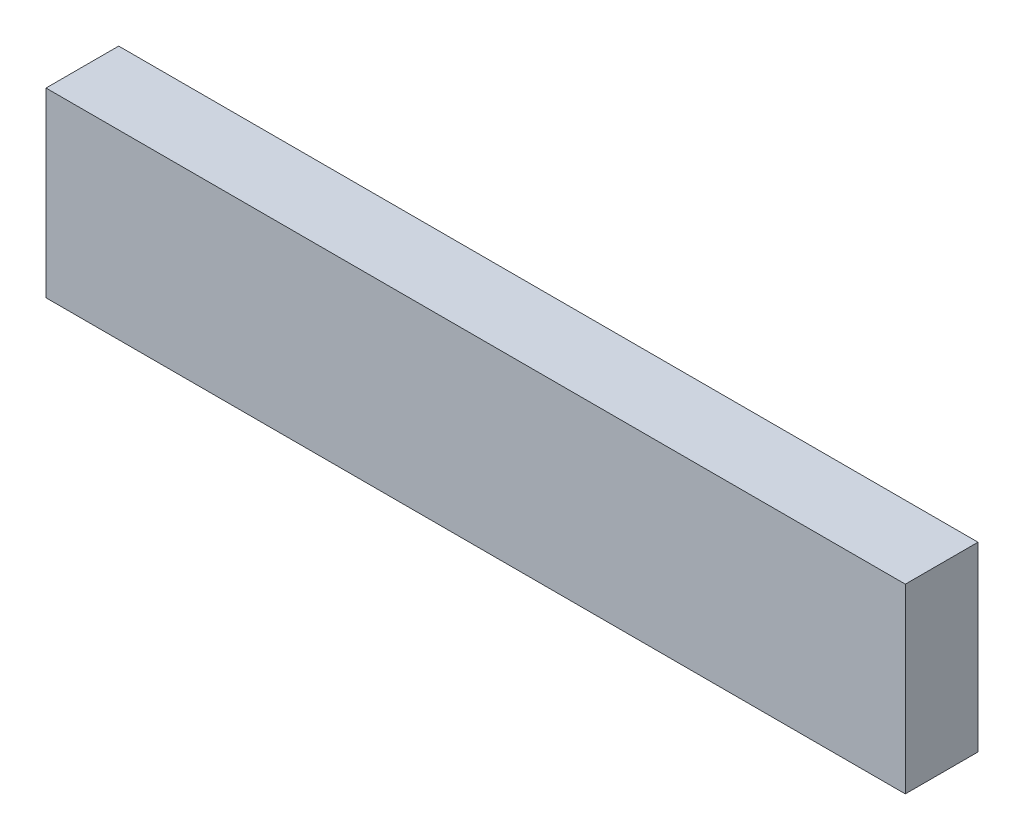
ISO-10303-21;
HEADER;
FILE_DESCRIPTION(('STEP AP214'),'2;1');
FILE_NAME('part.step','',(''),(''),'','','');
FILE_SCHEMA(('AUTOMOTIVE_DESIGN { 1 0 10303 214 1 1 1 1 }'));
ENDSEC;
DATA;
#1=APPLICATION_CONTEXT('core data for automotive mechanical design processes');
#2=APPLICATION_PROTOCOL_DEFINITION('international standard','automotive_design',2000,#1);
#3=PRODUCT_CONTEXT('',#1,'mechanical');
#4=PRODUCT('Part','Part','',(#3));
#5=PRODUCT_RELATED_PRODUCT_CATEGORY('part','',(#4));
#6=PRODUCT_DEFINITION_FORMATION('','',#4);
#7=PRODUCT_DEFINITION_CONTEXT('part definition',#1,'design');
#8=PRODUCT_DEFINITION('design','',#6,#7);
#9=PRODUCT_DEFINITION_SHAPE('','',#8);
#10=(LENGTH_UNIT() NAMED_UNIT(*) SI_UNIT(.MILLI.,.METRE.));
#11=(NAMED_UNIT(*) PLANE_ANGLE_UNIT() SI_UNIT($,.RADIAN.));
#12=(NAMED_UNIT(*) SI_UNIT($,.STERADIAN.) SOLID_ANGLE_UNIT());
#13=UNCERTAINTY_MEASURE_WITH_UNIT(LENGTH_MEASURE(1.E-05),#10,'distance_accuracy_value','');
#14=(GEOMETRIC_REPRESENTATION_CONTEXT(3) GLOBAL_UNCERTAINTY_ASSIGNED_CONTEXT((#13)) GLOBAL_UNIT_ASSIGNED_CONTEXT((#10,
#11,#12)) REPRESENTATION_CONTEXT('',''));
#15=CARTESIAN_POINT('',(0.,0.,0.));
#16=DIRECTION('',(0.,0.,1.));
#17=DIRECTION('',(1.,0.,0.));
#18=AXIS2_PLACEMENT_3D('',#15,#16,#17);
#19=CARTESIAN_POINT('',(0.,0.,304.301184893806));
#20=DIRECTION('',(0.,0.,1.));
#21=DIRECTION('',(1.,0.,0.));
#22=AXIS2_PLACEMENT_3D('',#19,#20,#21);
#23=PLANE('',#22);
#24=DIRECTION('',(0.,-1.,0.));
#25=VECTOR('',#24,1.);
#26=CARTESIAN_POINT('',(191.3,77.9866537043276,304.301184893806));
#27=LINE('',#26,#25);
#28=CARTESIAN_POINT('',(191.3,77.9866537043276,304.301184893806));
#29=VERTEX_POINT('',#28);
#30=CARTESIAN_POINT('',(191.3,67.9866537043276,304.301184893806));
#31=VERTEX_POINT('',#30);
#32=EDGE_CURVE('E80',#29,#31,#27,.T.);
#33=ORIENTED_EDGE('',*,*,#32,.T.);
#34=DIRECTION('',(1.,0.,0.));
#35=VECTOR('',#34,1.);
#36=CARTESIAN_POINT('',(191.3,67.9866537043276,304.301184893806));
#37=LINE('',#36,#35);
#38=CARTESIAN_POINT('',(238.599999999999,67.9866537043276,304.301184893806));
#39=VERTEX_POINT('',#38);
#40=EDGE_CURVE('E76',#31,#39,#37,.T.);
#41=ORIENTED_EDGE('',*,*,#40,.T.);
#42=DIRECTION('',(0.,1.,0.));
#43=VECTOR('',#42,1.);
#44=CARTESIAN_POINT('',(238.599999999999,77.9866537043276,304.301184893806));
#45=LINE('',#44,#43);
#46=CARTESIAN_POINT('',(238.599999999999,77.9866537043276,304.301184893806));
#47=VERTEX_POINT('',#46);
#48=EDGE_CURVE('E78',#39,#47,#45,.T.);
#49=ORIENTED_EDGE('',*,*,#48,.T.);
#50=DIRECTION('',(-1.,0.,0.));
#51=VECTOR('',#50,1.);
#52=CARTESIAN_POINT('',(191.3,77.9866537043276,304.301184893806));
#53=LINE('',#52,#51);
#54=EDGE_CURVE('E50',#47,#29,#53,.T.);
#55=ORIENTED_EDGE('',*,*,#54,.T.);
#56=EDGE_LOOP('',(#33,#41,#49,#55));
#57=FACE_BOUND('',#56,.T.);
#58=ADVANCED_FACE('F33',(#57),#23,.T.);
#59=CARTESIAN_POINT('',(191.3,77.9866537043276,304.301184893806));
#60=DIRECTION('',(0.,-1.,0.));
#61=DIRECTION('',(0.,0.,-1.));
#62=AXIS2_PLACEMENT_3D('',#59,#60,#61);
#63=PLANE('',#62);
#64=DIRECTION('',(-1.,0.,0.));
#65=VECTOR('',#64,1.);
#66=CARTESIAN_POINT('',(191.3,77.9866537043276,300.301184893806));
#67=LINE('',#66,#65);
#68=CARTESIAN_POINT('',(238.599999999999,77.9866537043276,300.301184893806));
#69=VERTEX_POINT('',#68);
#70=CARTESIAN_POINT('',(191.3,77.9866537043276,300.301184893806));
#71=VERTEX_POINT('',#70);
#72=EDGE_CURVE('E95',#69,#71,#67,.T.);
#73=ORIENTED_EDGE('',*,*,#72,.T.);
#74=DIRECTION('',(0.,0.,-1.));
#75=VECTOR('',#74,1.);
#76=CARTESIAN_POINT('',(191.3,77.9866537043276,304.301184893806));
#77=LINE('',#76,#75);
#78=EDGE_CURVE('E90',#29,#71,#77,.T.);
#79=ORIENTED_EDGE('',*,*,#78,.F.);
#80=ORIENTED_EDGE('',*,*,#54,.F.);
#81=DIRECTION('',(0.,0.,-1.));
#82=VECTOR('',#81,1.);
#83=CARTESIAN_POINT('',(238.599999999999,77.9866537043276,304.301184893806));
#84=LINE('',#83,#82);
#85=EDGE_CURVE('E85',#47,#69,#84,.T.);
#86=ORIENTED_EDGE('',*,*,#85,.T.);
#87=EDGE_LOOP('',(#73,#79,#80,#86));
#88=FACE_BOUND('',#87,.T.);
#89=ADVANCED_FACE('F107',(#88),#63,.F.);
#90=CARTESIAN_POINT('',(238.599999999999,77.9866537043276,304.301184893806));
#91=DIRECTION('',(-1.,0.,0.));
#92=DIRECTION('',(0.,0.,1.));
#93=AXIS2_PLACEMENT_3D('',#90,#91,#92);
#94=PLANE('',#93);
#95=DIRECTION('',(0.,1.,0.));
#96=VECTOR('',#95,1.);
#97=CARTESIAN_POINT('',(238.599999999999,77.9866537043276,300.301184893806));
#98=LINE('',#97,#96);
#99=CARTESIAN_POINT('',(238.599999999999,67.9866537043276,300.301184893806));
#100=VERTEX_POINT('',#99);
#101=EDGE_CURVE('E70',#100,#69,#98,.T.);
#102=ORIENTED_EDGE('',*,*,#101,.T.);
#103=ORIENTED_EDGE('',*,*,#85,.F.);
#104=ORIENTED_EDGE('',*,*,#48,.F.);
#105=DIRECTION('',(0.,0.,-1.));
#106=VECTOR('',#105,1.);
#107=CARTESIAN_POINT('',(238.599999999999,67.9866537043276,304.301184893806));
#108=LINE('',#107,#106);
#109=EDGE_CURVE('E83',#39,#100,#108,.T.);
#110=ORIENTED_EDGE('',*,*,#109,.T.);
#111=EDGE_LOOP('',(#102,#103,#104,#110));
#112=FACE_BOUND('',#111,.T.);
#113=ADVANCED_FACE('F87',(#112),#94,.F.);
#114=CARTESIAN_POINT('',(191.3,67.9866537043276,304.301184893806));
#115=DIRECTION('',(0.,1.,0.));
#116=DIRECTION('',(0.,0.,1.));
#117=AXIS2_PLACEMENT_3D('',#114,#115,#116);
#118=PLANE('',#117);
#119=DIRECTION('',(1.,0.,0.));
#120=VECTOR('',#119,1.);
#121=CARTESIAN_POINT('',(191.3,67.9866537043276,300.301184893806));
#122=LINE('',#121,#120);
#123=CARTESIAN_POINT('',(191.3,67.9866537043276,300.301184893806));
#124=VERTEX_POINT('',#123);
#125=EDGE_CURVE('E11',#124,#100,#122,.T.);
#126=ORIENTED_EDGE('',*,*,#125,.T.);
#127=ORIENTED_EDGE('',*,*,#109,.F.);
#128=ORIENTED_EDGE('',*,*,#40,.F.);
#129=DIRECTION('',(0.,0.,-1.));
#130=VECTOR('',#129,1.);
#131=CARTESIAN_POINT('',(191.3,67.9866537043276,304.301184893806));
#132=LINE('',#131,#130);
#133=EDGE_CURVE('E42',#31,#124,#132,.T.);
#134=ORIENTED_EDGE('',*,*,#133,.T.);
#135=EDGE_LOOP('',(#126,#127,#128,#134));
#136=FACE_BOUND('',#135,.T.);
#137=ADVANCED_FACE('F84',(#136),#118,.F.);
#138=CARTESIAN_POINT('',(0.,0.,300.301184893806));
#139=DIRECTION('',(0.,0.,1.));
#140=DIRECTION('',(1.,0.,0.));
#141=AXIS2_PLACEMENT_3D('',#138,#139,#140);
#142=PLANE('',#141);
#143=ORIENTED_EDGE('',*,*,#101,.F.);
#144=ORIENTED_EDGE('',*,*,#125,.F.);
#145=DIRECTION('',(0.,-1.,0.));
#146=VECTOR('',#145,1.);
#147=CARTESIAN_POINT('',(191.3,77.9866537043276,300.301184893806));
#148=LINE('',#147,#146);
#149=EDGE_CURVE('E96',#71,#124,#148,.T.);
#150=ORIENTED_EDGE('',*,*,#149,.F.);
#151=ORIENTED_EDGE('',*,*,#72,.F.);
#152=EDGE_LOOP('',(#143,#144,#150,#151));
#153=FACE_BOUND('',#152,.T.);
#154=ADVANCED_FACE('F105',(#153),#142,.F.);
#155=CARTESIAN_POINT('',(191.3,79.4930375250604,252.237311152431));
#156=DIRECTION('',(-1.,0.,0.));
#157=DIRECTION('',(0.,-1.,0.));
#158=AXIS2_PLACEMENT_3D('',#155,#156,#157);
#159=PLANE('',#158);
#160=ORIENTED_EDGE('',*,*,#149,.T.);
#161=ORIENTED_EDGE('',*,*,#133,.F.);
#162=ORIENTED_EDGE('',*,*,#32,.F.);
#163=ORIENTED_EDGE('',*,*,#78,.T.);
#164=EDGE_LOOP('',(#160,#161,#162,#163));
#165=FACE_BOUND('',#164,.T.);
#166=ADVANCED_FACE('F35',(#165),#159,.T.);
#167=CLOSED_SHELL('',(#58,#89,#113,#137,#154,#166));
#168=MANIFOLD_SOLID_BREP('B2',#167);
#169=ADVANCED_BREP_SHAPE_REPRESENTATION('',(#18,#168),#14);
#170=SHAPE_DEFINITION_REPRESENTATION(#9,#169);
ENDSEC;
END-ISO-10303-21;
